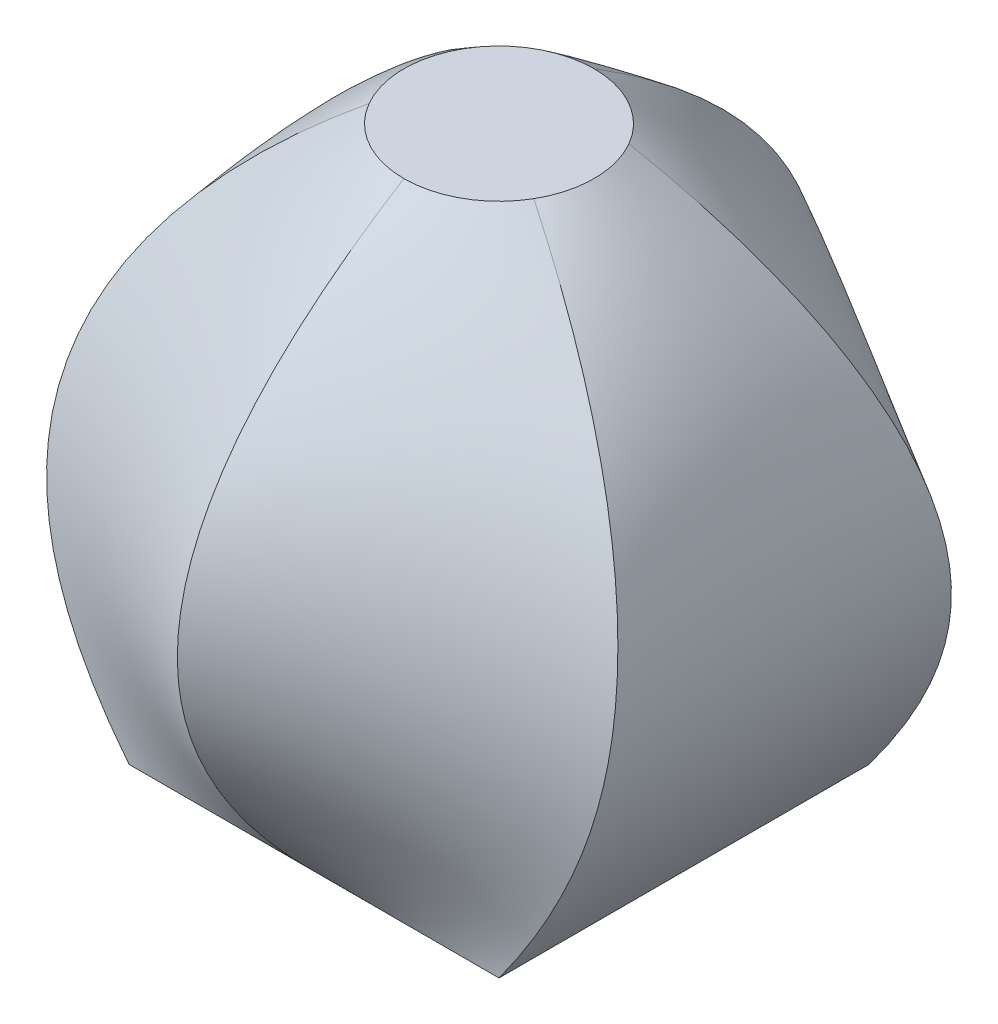
ISO-10303-21;
HEADER;
FILE_DESCRIPTION(('STEP AP214'),'2;1');
FILE_NAME('part.step','',(''),(''),'','','');
FILE_SCHEMA(('AUTOMOTIVE_DESIGN { 1 0 10303 214 1 1 1 1 }'));
ENDSEC;
DATA;
#1=APPLICATION_CONTEXT('core data for automotive mechanical design processes');
#2=APPLICATION_PROTOCOL_DEFINITION('international standard','automotive_design',2000,#1);
#3=PRODUCT_CONTEXT('',#1,'mechanical');
#4=PRODUCT('Part','Part','',(#3));
#5=PRODUCT_RELATED_PRODUCT_CATEGORY('part','',(#4));
#6=PRODUCT_DEFINITION_FORMATION('','',#4);
#7=PRODUCT_DEFINITION_CONTEXT('part definition',#1,'design');
#8=PRODUCT_DEFINITION('design','',#6,#7);
#9=PRODUCT_DEFINITION_SHAPE('','',#8);
#10=(LENGTH_UNIT() NAMED_UNIT(*) SI_UNIT(.MILLI.,.METRE.));
#11=(NAMED_UNIT(*) PLANE_ANGLE_UNIT() SI_UNIT($,.RADIAN.));
#12=(NAMED_UNIT(*) SI_UNIT($,.STERADIAN.) SOLID_ANGLE_UNIT());
#13=UNCERTAINTY_MEASURE_WITH_UNIT(LENGTH_MEASURE(1.E-05),#10,'distance_accuracy_value','');
#14=(GEOMETRIC_REPRESENTATION_CONTEXT(3) GLOBAL_UNCERTAINTY_ASSIGNED_CONTEXT((#13)) GLOBAL_UNIT_ASSIGNED_CONTEXT((#10,
#11,#12)) REPRESENTATION_CONTEXT('',''));
#15=CARTESIAN_POINT('',(0.,0.,0.));
#16=DIRECTION('',(0.,0.,1.));
#17=DIRECTION('',(1.,0.,0.));
#18=AXIS2_PLACEMENT_3D('',#15,#16,#17);
#19=CARTESIAN_POINT('',(0.,152.4,0.));
#20=DIRECTION('',(0.,1.,0.));
#21=DIRECTION('',(0.,0.,1.));
#22=AXIS2_PLACEMENT_3D('',#19,#20,#21);
#23=PLANE('',#22);
#24=CARTESIAN_POINT('',(0.,152.4,0.));
#25=DIRECTION('',(0.,1.,0.));
#26=DIRECTION('',(0.,0.,1.));
#27=AXIS2_PLACEMENT_3D('',#24,#25,#26);
#28=CIRCLE('',#27,26.1274271172022);
#29=CARTESIAN_POINT('',(0.,152.4,-26.1274271172022));
#30=VERTEX_POINT('',#29);
#31=CARTESIAN_POINT('',(-22.6270156190236,152.4,-13.0637135586011));
#32=VERTEX_POINT('',#31);
#33=EDGE_CURVE('E12',#30,#32,#28,.T.);
#34=ORIENTED_EDGE('',*,*,#33,.T.);
#35=CARTESIAN_POINT('',(-22.6270156190235,152.4,13.0637135586012));
#36=VERTEX_POINT('',#35);
#37=EDGE_CURVE('E85',#32,#36,#28,.T.);
#38=ORIENTED_EDGE('',*,*,#37,.T.);
#39=CARTESIAN_POINT('',(0.,152.4,26.1274271172022));
#40=VERTEX_POINT('',#39);
#41=EDGE_CURVE('E249',#36,#40,#28,.T.);
#42=ORIENTED_EDGE('',*,*,#41,.T.);
#43=CARTESIAN_POINT('',(22.6270156190236,152.4,13.0637135586009));
#44=VERTEX_POINT('',#43);
#45=EDGE_CURVE('E99',#40,#44,#28,.T.);
#46=ORIENTED_EDGE('',*,*,#45,.T.);
#47=CARTESIAN_POINT('',(22.6270156190234,152.4,-13.0637135586014));
#48=VERTEX_POINT('',#47);
#49=EDGE_CURVE('E93',#44,#48,#28,.T.);
#50=ORIENTED_EDGE('',*,*,#49,.T.);
#51=EDGE_CURVE('E162',#48,#30,#28,.T.);
#52=ORIENTED_EDGE('',*,*,#51,.T.);
#53=EDGE_LOOP('',(#34,#38,#42,#46,#50,#52));
#54=FACE_BOUND('',#53,.T.);
#55=ADVANCED_FACE('F75',(#54),#23,.T.);
#56=CARTESIAN_POINT('',(0.,0.,0.));
#57=DIRECTION('',(0.,1.,0.));
#58=DIRECTION('',(0.,0.,1.));
#59=AXIS2_PLACEMENT_3D('',#56,#57,#58);
#60=PLANE('',#59);
#61=DIRECTION('',(0.,0.,-1.));
#62=VECTOR('',#61,1.);
#63=CARTESIAN_POINT('',(50.8,0.,50.8));
#64=LINE('',#63,#62);
#65=CARTESIAN_POINT('',(50.8,0.,50.8));
#66=VERTEX_POINT('',#65);
#67=CARTESIAN_POINT('',(50.8,0.,-50.8));
#68=VERTEX_POINT('',#67);
#69=EDGE_CURVE('E137',#66,#68,#64,.T.);
#70=ORIENTED_EDGE('',*,*,#69,.F.);
#71=DIRECTION('',(1.,0.,0.));
#72=VECTOR('',#71,1.);
#73=CARTESIAN_POINT('',(0.,0.,50.8));
#74=LINE('',#73,#72);
#75=CARTESIAN_POINT('',(0.,0.,50.8));
#76=VERTEX_POINT('',#75);
#77=EDGE_CURVE('E157',#76,#66,#74,.T.);
#78=ORIENTED_EDGE('',*,*,#77,.F.);
#79=CARTESIAN_POINT('',(-50.8,0.,50.8));
#80=VERTEX_POINT('',#79);
#81=EDGE_CURVE('E317',#80,#76,#74,.T.);
#82=ORIENTED_EDGE('',*,*,#81,.F.);
#83=DIRECTION('',(0.,0.,1.));
#84=VECTOR('',#83,1.);
#85=CARTESIAN_POINT('',(-50.8,0.,50.8));
#86=LINE('',#85,#84);
#87=CARTESIAN_POINT('',(-50.8,0.,-50.8));
#88=VERTEX_POINT('',#87);
#89=EDGE_CURVE('E319',#88,#80,#86,.T.);
#90=ORIENTED_EDGE('',*,*,#89,.F.);
#91=DIRECTION('',(-1.,0.,0.));
#92=VECTOR('',#91,1.);
#93=CARTESIAN_POINT('',(-50.8,0.,-50.8));
#94=LINE('',#93,#92);
#95=CARTESIAN_POINT('',(0.,0.,-50.8));
#96=VERTEX_POINT('',#95);
#97=EDGE_CURVE('E140',#96,#88,#94,.T.);
#98=ORIENTED_EDGE('',*,*,#97,.F.);
#99=EDGE_CURVE('E132',#68,#96,#94,.T.);
#100=ORIENTED_EDGE('',*,*,#99,.F.);
#101=EDGE_LOOP('',(#70,#78,#82,#90,#98,#100));
#102=FACE_BOUND('',#101,.T.);
#103=ADVANCED_FACE('F135',(#102),#60,.F.);
#104=CARTESIAN_POINT('',(0.,0.,-50.8));
#105=CARTESIAN_POINT('',(0.,28.0043059128189,-79.2825959046525));
#106=CARTESIAN_POINT('',(0.,81.7473956789805,-103.811170030036));
#107=CARTESIAN_POINT('',(0.,129.604305912819,-62.8342139827873));
#108=CARTESIAN_POINT('',(0.,152.4,-26.1274271172022));
#109=CARTESIAN_POINT('',(-16.9333333333333,0.,-50.8));
#110=CARTESIAN_POINT('',(-23.9500762275391,28.1795078254095,-70.1140972458688));
#111=CARTESIAN_POINT('',(-28.772302791769,81.5699340289015,-82.9612033094311));
#112=CARTESIAN_POINT('',(-19.4801423632636,129.779507825409,-55.117239052737));
#113=CARTESIAN_POINT('',(-9.33306787117156,152.4,-26.1274271172022));
#114=CARTESIAN_POINT('',(-33.8666666666667,0.,-50.8));
#115=CARTESIAN_POINT('',(-47.9001524550782,28.354709738,-60.9455985870851));
#116=CARTESIAN_POINT('',(-57.8451331030771,81.3924723788225,-64.2325869629153));
#117=CARTESIAN_POINT('',(-38.2546306676219,129.954709738,-42.4192244357646));
#118=CARTESIAN_POINT('',(-17.9604816834378,152.4,-21.14638743028));
#119=CARTESIAN_POINT('',(-50.8,0.,-50.8));
#120=CARTESIAN_POINT('',(-71.8502286826173,28.5299116505906,-51.7770999283014));
#121=CARTESIAN_POINT('',(-88.6048429689042,81.2150107287436,-46.8249102699012));
#122=CARTESIAN_POINT('',(-53.0682390952997,130.129911650591,-26.6195756340354));
#123=CARTESIAN_POINT('',(-22.6270156190236,152.4,-13.0637135586011));
#124=B_SPLINE_SURFACE_WITH_KNOTS('',3,3,((#104,#105,#106,#107,#108),(#109,#110,#111,#112,#113),
(#114,#115,#116,#117,#118),(#119,#120,#121,#122,#123)),.UNSPECIFIED.,.F.,.F.,.F.,(4,4),(4,1,4),
(0.,1.),(0.,0.459976164553871,1.),.UNSPECIFIED.);
#125=CARTESIAN_POINT('',(-50.8,0.,-50.8));
#126=CARTESIAN_POINT('',(-71.8502286826173,28.5299116505906,-51.7770999283014));
#127=CARTESIAN_POINT('',(-88.6048429689042,81.2150107287436,-46.8249102699012));
#128=CARTESIAN_POINT('',(-53.0682390952997,130.129911650591,-26.6195756340354));
#129=CARTESIAN_POINT('',(-22.6270156190236,152.4,-13.0637135586011));
#130=B_SPLINE_CURVE_WITH_KNOTS('',3,(#125,#126,#127,#128,#129),.UNSPECIFIED.,.F.,.F.,(4,1,4),
(0.,0.459976164553871,1.),.UNSPECIFIED.);
#131=EDGE_CURVE('E181',#88,#32,#130,.T.);
#132=CARTESIAN_POINT('',(0.,0.,-50.8));
#133=CARTESIAN_POINT('',(0.,28.0043059128189,-79.2825959046525));
#134=CARTESIAN_POINT('',(0.,81.7473956789805,-103.811170030036));
#135=CARTESIAN_POINT('',(0.,129.604305912819,-62.8342139827873));
#136=CARTESIAN_POINT('',(0.,152.4,-26.1274271172022));
#137=B_SPLINE_CURVE_WITH_KNOTS('',3,(#132,#133,#134,#135,#136),.UNSPECIFIED.,.F.,.F.,(4,1,4),
(0.,0.459976164553871,1.),.UNSPECIFIED.);
#138=EDGE_CURVE('E145',#30,#96,#137,.F.);
#139=ORIENTED_EDGE('',*,*,#97,.T.);
#140=ORIENTED_EDGE('',*,*,#131,.T.);
#141=ORIENTED_EDGE('',*,*,#33,.F.);
#142=ORIENTED_EDGE('',*,*,#138,.T.);
#143=EDGE_LOOP('',(#139,#140,#141,#142));
#144=FACE_BOUND('',#143,.T.);
#145=ADVANCED_FACE('F198',(#144),#124,.T.);
#146=CARTESIAN_POINT('',(-50.8,0.,-50.8));
#147=CARTESIAN_POINT('',(-71.8502286826173,28.5299116505906,-51.7770999283014));
#148=CARTESIAN_POINT('',(-88.6048429689042,81.2150107287436,-46.8249102699012));
#149=CARTESIAN_POINT('',(-53.0682390952997,130.129911650591,-26.6195756340354));
#150=CARTESIAN_POINT('',(-22.6270156190236,152.4,-13.0637135586011));
#151=CARTESIAN_POINT('',(-50.8,0.,-16.9333333333333));
#152=CARTESIAN_POINT('',(-71.8502286826173,28.5299116505906,-17.2590333094338));
#153=CARTESIAN_POINT('',(-86.6174358948461,81.2150107287436,-15.3414998497713));
#154=CARTESIAN_POINT('',(-57.7347730308855,130.129911650591,-9.49966037873361));
#155=CARTESIAN_POINT('',(-27.2935495546093,152.4,-4.98103968692212));
#156=CARTESIAN_POINT('',(-50.8,0.,16.9333333333333));
#157=CARTESIAN_POINT('',(-71.8502286826173,28.5299116505906,17.2590333094337));
#158=CARTESIAN_POINT('',(-86.6174358948461,81.2150107287436,15.3414998497712));
#159=CARTESIAN_POINT('',(-57.7347730308854,130.129911650591,9.49966037873367));
#160=CARTESIAN_POINT('',(-27.2935495546093,152.4,4.9810396869223));
#161=CARTESIAN_POINT('',(-50.8,0.,50.8));
#162=CARTESIAN_POINT('',(-71.8502286826173,28.5299116505906,51.7770999283013));
#163=CARTESIAN_POINT('',(-88.6048429689042,81.2150107287436,46.8249102699011));
#164=CARTESIAN_POINT('',(-53.0682390952997,130.129911650591,26.6195756340354));
#165=CARTESIAN_POINT('',(-22.6270156190235,152.4,13.0637135586012));
#166=B_SPLINE_SURFACE_WITH_KNOTS('',3,3,((#146,#147,#148,#149,#150),(#151,#152,#153,#154,#155),
(#156,#157,#158,#159,#160),(#161,#162,#163,#164,#165)),.UNSPECIFIED.,.F.,.F.,.F.,(4,4),(4,1,4),
(0.,1.),(0.,0.459976164553871,1.),.UNSPECIFIED.);
#167=CARTESIAN_POINT('',(-50.8,0.,50.8));
#168=CARTESIAN_POINT('',(-71.8502286826173,28.5299116505906,51.7770999283013));
#169=CARTESIAN_POINT('',(-88.6048429689042,81.2150107287436,46.8249102699011));
#170=CARTESIAN_POINT('',(-53.0682390952997,130.129911650591,26.6195756340354));
#171=CARTESIAN_POINT('',(-22.6270156190235,152.4,13.0637135586012));
#172=B_SPLINE_CURVE_WITH_KNOTS('',3,(#167,#168,#169,#170,#171),.UNSPECIFIED.,.F.,.F.,(4,1,4),
(0.,0.459976164553871,1.),.UNSPECIFIED.);
#173=EDGE_CURVE('E291',#80,#36,#172,.T.);
#174=ORIENTED_EDGE('',*,*,#89,.T.);
#175=ORIENTED_EDGE('',*,*,#173,.T.);
#176=ORIENTED_EDGE('',*,*,#37,.F.);
#177=ORIENTED_EDGE('',*,*,#131,.F.);
#178=EDGE_LOOP('',(#174,#175,#176,#177));
#179=FACE_BOUND('',#178,.T.);
#180=ADVANCED_FACE('F210',(#179),#166,.T.);
#181=CARTESIAN_POINT('',(50.8,0.,-50.8));
#182=CARTESIAN_POINT('',(71.8502286826173,28.5299116505906,-51.7770999283013));
#183=CARTESIAN_POINT('',(88.6048429689042,81.2150107287436,-46.8249102699011));
#184=CARTESIAN_POINT('',(53.0682390952996,130.129911650591,-26.6195756340356));
#185=CARTESIAN_POINT('',(22.6270156190234,152.4,-13.0637135586014));
#186=CARTESIAN_POINT('',(33.8666666666667,0.,-50.8));
#187=CARTESIAN_POINT('',(47.9001524550782,28.354709738,-60.945598587085));
#188=CARTESIAN_POINT('',(57.8451331030771,81.3924723788226,-64.2325869629154));
#189=CARTESIAN_POINT('',(38.2546306676217,129.954709738,-42.4192244357646));
#190=CARTESIAN_POINT('',(17.9604816834376,152.4,-21.1463874302801));
#191=CARTESIAN_POINT('',(16.9333333333333,0.,-50.8));
#192=CARTESIAN_POINT('',(23.9500762275391,28.1795078254095,-70.1140972458688));
#193=CARTESIAN_POINT('',(28.772302791769,81.5699340289015,-82.9612033094312));
#194=CARTESIAN_POINT('',(19.4801423632635,129.779507825409,-55.117239052737));
#195=CARTESIAN_POINT('',(9.33306787117143,152.4,-26.1274271172022));
#196=CARTESIAN_POINT('',(0.,0.,-50.8));
#197=CARTESIAN_POINT('',(0.,28.0043059128189,-79.2825959046525));
#198=CARTESIAN_POINT('',(0.,81.7473956789805,-103.811170030036));
#199=CARTESIAN_POINT('',(0.,129.604305912819,-62.8342139827873));
#200=CARTESIAN_POINT('',(0.,152.4,-26.1274271172022));
#201=B_SPLINE_SURFACE_WITH_KNOTS('',3,3,((#181,#182,#183,#184,#185),(#186,#187,#188,#189,#190),
(#191,#192,#193,#194,#195),(#196,#197,#198,#199,#200)),.UNSPECIFIED.,.F.,.F.,.F.,(4,4),(4,1,4),
(0.,1.),(0.,0.459976164553871,1.),.UNSPECIFIED.);
#202=CARTESIAN_POINT('',(50.8,0.,-50.8));
#203=CARTESIAN_POINT('',(71.8502286826173,28.5299116505906,-51.7770999283013));
#204=CARTESIAN_POINT('',(88.6048429689042,81.2150107287436,-46.8249102699011));
#205=CARTESIAN_POINT('',(53.0682390952996,130.129911650591,-26.6195756340356));
#206=CARTESIAN_POINT('',(22.6270156190234,152.4,-13.0637135586014));
#207=B_SPLINE_CURVE_WITH_KNOTS('',3,(#202,#203,#204,#205,#206),.UNSPECIFIED.,.F.,.F.,(4,1,4),
(0.,0.459976164553871,1.),.UNSPECIFIED.);
#208=EDGE_CURVE('E154',#68,#48,#207,.T.);
#209=ORIENTED_EDGE('',*,*,#99,.T.);
#210=ORIENTED_EDGE('',*,*,#138,.F.);
#211=ORIENTED_EDGE('',*,*,#51,.F.);
#212=ORIENTED_EDGE('',*,*,#208,.F.);
#213=EDGE_LOOP('',(#209,#210,#211,#212));
#214=FACE_BOUND('',#213,.T.);
#215=ADVANCED_FACE('F161',(#214),#201,.T.);
#216=CARTESIAN_POINT('',(-50.8,0.,50.8));
#217=CARTESIAN_POINT('',(-71.8502286826173,28.5299116505906,51.7770999283013));
#218=CARTESIAN_POINT('',(-88.6048429689042,81.2150107287436,46.8249102699011));
#219=CARTESIAN_POINT('',(-53.0682390952996,130.129911650591,26.6195756340354));
#220=CARTESIAN_POINT('',(-22.6270156190235,152.4,13.0637135586012));
#221=CARTESIAN_POINT('',(-33.8666666666667,0.,50.8));
#222=CARTESIAN_POINT('',(-47.9001524550782,28.354709738,60.945598587085));
#223=CARTESIAN_POINT('',(-57.8451331030771,81.3924723788226,64.2325869629153));
#224=CARTESIAN_POINT('',(-38.2546306676218,129.954709738,42.4192244357646));
#225=CARTESIAN_POINT('',(-17.9604816834377,152.4,21.1463874302801));
#226=CARTESIAN_POINT('',(-16.9333333333333,0.,50.8));
#227=CARTESIAN_POINT('',(-23.9500762275391,28.1795078254095,70.1140972458687));
#228=CARTESIAN_POINT('',(-28.7723027917691,81.5699340289015,82.9612033094311));
#229=CARTESIAN_POINT('',(-19.4801423632636,129.779507825409,55.117239052737));
#230=CARTESIAN_POINT('',(-9.3330678711715,152.4,26.1274271172022));
#231=CARTESIAN_POINT('',(0.,0.,50.8));
#232=CARTESIAN_POINT('',(0.,28.0043059128189,79.2825959046524));
#233=CARTESIAN_POINT('',(0.,81.7473956789805,103.811170030036));
#234=CARTESIAN_POINT('',(0.,129.604305912819,62.8342139827873));
#235=CARTESIAN_POINT('',(0.,152.4,26.1274271172022));
#236=B_SPLINE_SURFACE_WITH_KNOTS('',3,3,((#216,#217,#218,#219,#220),(#221,#222,#223,#224,#225),
(#226,#227,#228,#229,#230),(#231,#232,#233,#234,#235)),.UNSPECIFIED.,.F.,.F.,.F.,(4,4),(4,1,4),
(0.,1.),(0.,0.459976164553871,1.),.UNSPECIFIED.);
#237=CARTESIAN_POINT('',(0.,0.,50.8));
#238=CARTESIAN_POINT('',(0.,28.0043059128189,79.2825959046524));
#239=CARTESIAN_POINT('',(0.,81.7473956789805,103.811170030036));
#240=CARTESIAN_POINT('',(0.,129.604305912819,62.8342139827873));
#241=CARTESIAN_POINT('',(0.,152.4,26.1274271172022));
#242=B_SPLINE_CURVE_WITH_KNOTS('',3,(#237,#238,#239,#240,#241),.UNSPECIFIED.,.F.,.F.,(4,1,4),
(0.,0.459976164553871,1.),.UNSPECIFIED.);
#243=EDGE_CURVE('E166',#76,#40,#242,.T.);
#244=ORIENTED_EDGE('',*,*,#81,.T.);
#245=ORIENTED_EDGE('',*,*,#243,.T.);
#246=ORIENTED_EDGE('',*,*,#41,.F.);
#247=ORIENTED_EDGE('',*,*,#173,.F.);
#248=EDGE_LOOP('',(#244,#245,#246,#247));
#249=FACE_BOUND('',#248,.T.);
#250=ADVANCED_FACE('F255',(#249),#236,.T.);
#251=CARTESIAN_POINT('',(0.,0.,50.8));
#252=CARTESIAN_POINT('',(0.,28.0043059128189,79.2825959046524));
#253=CARTESIAN_POINT('',(0.,81.7473956789805,103.811170030036));
#254=CARTESIAN_POINT('',(0.,129.604305912819,62.8342139827872));
#255=CARTESIAN_POINT('',(0.,152.4,26.1274271172022));
#256=CARTESIAN_POINT('',(16.9333333333333,0.,50.8));
#257=CARTESIAN_POINT('',(23.9500762275391,28.1795078254095,70.1140972458687));
#258=CARTESIAN_POINT('',(28.772302791769,81.5699340289015,82.961203309431));
#259=CARTESIAN_POINT('',(19.4801423632636,129.779507825409,55.117239052737));
#260=CARTESIAN_POINT('',(9.33306787117162,152.4,26.1274271172022));
#261=CARTESIAN_POINT('',(33.8666666666667,0.,50.8));
#262=CARTESIAN_POINT('',(47.9001524550782,28.354709738,60.9455985870851));
#263=CARTESIAN_POINT('',(57.845133103077,81.3924723788226,64.2325869629153));
#264=CARTESIAN_POINT('',(38.2546306676219,129.954709738,42.4192244357645));
#265=CARTESIAN_POINT('',(17.9604816834379,152.4,21.1463874302799));
#266=CARTESIAN_POINT('',(50.8,0.,50.8));
#267=CARTESIAN_POINT('',(71.8502286826173,28.5299116505906,51.7770999283014));
#268=CARTESIAN_POINT('',(88.6048429689041,81.2150107287436,46.8249102699011));
#269=CARTESIAN_POINT('',(53.0682390952997,130.129911650591,26.6195756340353));
#270=CARTESIAN_POINT('',(22.6270156190236,152.4,13.0637135586009));
#271=B_SPLINE_SURFACE_WITH_KNOTS('',3,3,((#251,#252,#253,#254,#255),(#256,#257,#258,#259,#260),
(#261,#262,#263,#264,#265),(#266,#267,#268,#269,#270)),.UNSPECIFIED.,.F.,.F.,.F.,(4,4),(4,1,4),
(0.,1.),(0.,0.459976164553871,1.),.UNSPECIFIED.);
#272=CARTESIAN_POINT('',(50.8,0.,50.8));
#273=CARTESIAN_POINT('',(71.8502286826173,28.5299116505906,51.7770999283014));
#274=CARTESIAN_POINT('',(88.6048429689041,81.2150107287436,46.8249102699011));
#275=CARTESIAN_POINT('',(53.0682390952997,130.129911650591,26.6195756340353));
#276=CARTESIAN_POINT('',(22.6270156190236,152.4,13.0637135586009));
#277=B_SPLINE_CURVE_WITH_KNOTS('',3,(#272,#273,#274,#275,#276),.UNSPECIFIED.,.F.,.F.,(4,1,4),
(0.,0.459976164553871,1.),.UNSPECIFIED.);
#278=EDGE_CURVE('E156',#66,#44,#277,.T.);
#279=ORIENTED_EDGE('',*,*,#77,.T.);
#280=ORIENTED_EDGE('',*,*,#278,.T.);
#281=ORIENTED_EDGE('',*,*,#45,.F.);
#282=ORIENTED_EDGE('',*,*,#243,.F.);
#283=EDGE_LOOP('',(#279,#280,#281,#282));
#284=FACE_BOUND('',#283,.T.);
#285=ADVANCED_FACE('F266',(#284),#271,.T.);
#286=CARTESIAN_POINT('',(50.8,0.,50.8));
#287=CARTESIAN_POINT('',(71.8502286826173,28.5299116505906,51.7770999283014));
#288=CARTESIAN_POINT('',(88.6048429689041,81.2150107287436,46.8249102699011));
#289=CARTESIAN_POINT('',(53.0682390952997,130.129911650591,26.6195756340353));
#290=CARTESIAN_POINT('',(22.6270156190237,152.4,13.0637135586009));
#291=CARTESIAN_POINT('',(50.8,0.,16.9333333333333));
#292=CARTESIAN_POINT('',(71.8502286826173,28.5299116505906,17.2590333094338));
#293=CARTESIAN_POINT('',(86.6174358948461,81.2150107287436,15.3414998497713));
#294=CARTESIAN_POINT('',(57.7347730308855,130.129911650591,9.49966037873347));
#295=CARTESIAN_POINT('',(27.2935495546094,152.4,4.98103968692193));
#296=CARTESIAN_POINT('',(50.8,0.,-16.9333333333333));
#297=CARTESIAN_POINT('',(71.8502286826173,28.5299116505906,-17.2590333094338));
#298=CARTESIAN_POINT('',(86.6174358948461,81.2150107287436,-15.3414998497712));
#299=CARTESIAN_POINT('',(57.7347730308854,130.129911650591,-9.49966037873383));
#300=CARTESIAN_POINT('',(27.2935495546092,152.4,-4.9810396869225));
#301=CARTESIAN_POINT('',(50.8,0.,-50.8));
#302=CARTESIAN_POINT('',(71.8502286826173,28.5299116505906,-51.7770999283013));
#303=CARTESIAN_POINT('',(88.6048429689042,81.2150107287436,-46.8249102699011));
#304=CARTESIAN_POINT('',(53.0682390952996,130.129911650591,-26.6195756340356));
#305=CARTESIAN_POINT('',(22.6270156190234,152.4,-13.0637135586014));
#306=B_SPLINE_SURFACE_WITH_KNOTS('',3,3,((#286,#287,#288,#289,#290),(#291,#292,#293,#294,#295),
(#296,#297,#298,#299,#300),(#301,#302,#303,#304,#305)),.UNSPECIFIED.,.F.,.F.,.F.,(4,4),(4,1,4),
(0.,1.),(0.,0.459976164553871,1.),.UNSPECIFIED.);
#307=ORIENTED_EDGE('',*,*,#69,.T.);
#308=ORIENTED_EDGE('',*,*,#208,.T.);
#309=ORIENTED_EDGE('',*,*,#49,.F.);
#310=ORIENTED_EDGE('',*,*,#278,.F.);
#311=EDGE_LOOP('',(#307,#308,#309,#310));
#312=FACE_BOUND('',#311,.T.);
#313=ADVANCED_FACE('F153',(#312),#306,.T.);
#314=CLOSED_SHELL('',(#55,#103,#145,#180,#215,#250,#285,#313));
#315=MANIFOLD_SOLID_BREP('B2',#314);
#316=ADVANCED_BREP_SHAPE_REPRESENTATION('',(#18,#315),#14);
#317=SHAPE_DEFINITION_REPRESENTATION(#9,#316);
ENDSEC;
END-ISO-10303-21;
